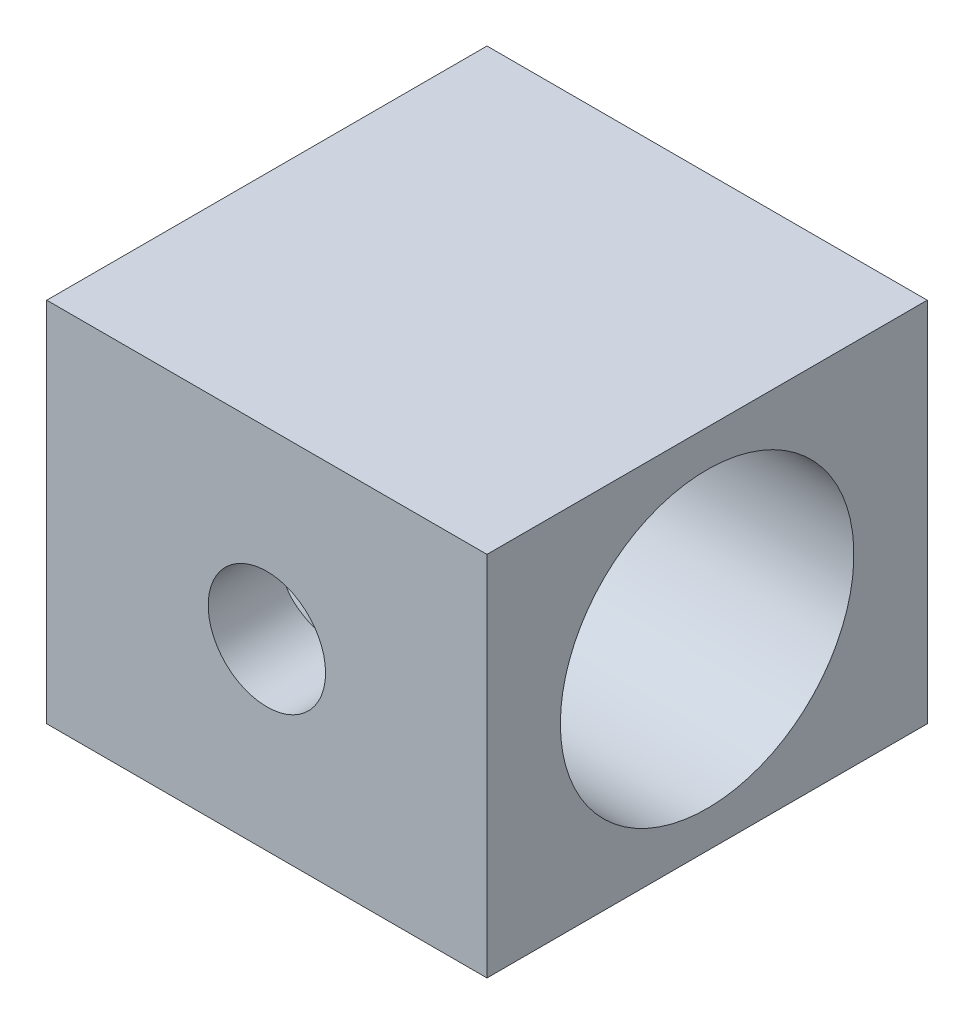
ISO-10303-21;
HEADER;
FILE_DESCRIPTION(('STEP AP214'),'2;1');
FILE_NAME('part.step','',(''),(''),'','','');
FILE_SCHEMA(('AUTOMOTIVE_DESIGN { 1 0 10303 214 1 1 1 1 }'));
ENDSEC;
DATA;
#1=APPLICATION_CONTEXT('core data for automotive mechanical design processes');
#2=APPLICATION_PROTOCOL_DEFINITION('international standard','automotive_design',2000,#1);
#3=PRODUCT_CONTEXT('',#1,'mechanical');
#4=PRODUCT('Part','Part','',(#3));
#5=PRODUCT_RELATED_PRODUCT_CATEGORY('part','',(#4));
#6=PRODUCT_DEFINITION_FORMATION('','',#4);
#7=PRODUCT_DEFINITION_CONTEXT('part definition',#1,'design');
#8=PRODUCT_DEFINITION('design','',#6,#7);
#9=PRODUCT_DEFINITION_SHAPE('','',#8);
#10=(LENGTH_UNIT() NAMED_UNIT(*) SI_UNIT(.MILLI.,.METRE.));
#11=(NAMED_UNIT(*) PLANE_ANGLE_UNIT() SI_UNIT($,.RADIAN.));
#12=(NAMED_UNIT(*) SI_UNIT($,.STERADIAN.) SOLID_ANGLE_UNIT());
#13=UNCERTAINTY_MEASURE_WITH_UNIT(LENGTH_MEASURE(1.E-05),#10,'distance_accuracy_value','');
#14=(GEOMETRIC_REPRESENTATION_CONTEXT(3) GLOBAL_UNCERTAINTY_ASSIGNED_CONTEXT((#13)) GLOBAL_UNIT_ASSIGNED_CONTEXT((#10,
#11,#12)) REPRESENTATION_CONTEXT('',''));
#15=CARTESIAN_POINT('',(0.,0.,0.));
#16=DIRECTION('',(0.,0.,1.));
#17=DIRECTION('',(1.,0.,0.));
#18=AXIS2_PLACEMENT_3D('',#15,#16,#17);
#19=CARTESIAN_POINT('',(15.,-12.5,15.));
#20=DIRECTION('',(-1.,0.,0.));
#21=DIRECTION('',(0.,0.,1.));
#22=AXIS2_PLACEMENT_3D('',#19,#20,#21);
#23=PLANE('',#22);
#24=CARTESIAN_POINT('',(15.,0.,0.));
#25=DIRECTION('',(-1.,0.,0.));
#26=DIRECTION('',(0.,0.,1.));
#27=AXIS2_PLACEMENT_3D('',#24,#25,#26);
#28=CIRCLE('',#27,10.);
#29=CARTESIAN_POINT('',(15.,0.,10.));
#30=VERTEX_POINT('',#29);
#31=EDGE_CURVE('E124',#30,#30,#28,.T.);
#32=ORIENTED_EDGE('',*,*,#31,.T.);
#33=EDGE_LOOP('',(#32));
#34=FACE_BOUND('',#33,.T.);
#35=DIRECTION('',(0.,1.,0.));
#36=VECTOR('',#35,1.);
#37=CARTESIAN_POINT('',(15.,-12.5,-15.));
#38=LINE('',#37,#36);
#39=CARTESIAN_POINT('',(15.,-12.5,-15.));
#40=VERTEX_POINT('',#39);
#41=CARTESIAN_POINT('',(15.,12.5,-15.));
#42=VERTEX_POINT('',#41);
#43=EDGE_CURVE('E120',#40,#42,#38,.T.);
#44=ORIENTED_EDGE('',*,*,#43,.T.);
#45=DIRECTION('',(0.,0.,-1.));
#46=VECTOR('',#45,1.);
#47=CARTESIAN_POINT('',(15.,12.5,15.));
#48=LINE('',#47,#46);
#49=CARTESIAN_POINT('',(15.,12.5,15.));
#50=VERTEX_POINT('',#49);
#51=EDGE_CURVE('E11',#50,#42,#48,.T.);
#52=ORIENTED_EDGE('',*,*,#51,.F.);
#53=DIRECTION('',(0.,1.,0.));
#54=VECTOR('',#53,1.);
#55=CARTESIAN_POINT('',(15.,-12.5,15.));
#56=LINE('',#55,#54);
#57=CARTESIAN_POINT('',(15.,-12.5,15.));
#58=VERTEX_POINT('',#57);
#59=EDGE_CURVE('E103',#58,#50,#56,.T.);
#60=ORIENTED_EDGE('',*,*,#59,.F.);
#61=DIRECTION('',(0.,0.,-1.));
#62=VECTOR('',#61,1.);
#63=CARTESIAN_POINT('',(15.,-12.5,15.));
#64=LINE('',#63,#62);
#65=EDGE_CURVE('E116',#58,#40,#64,.T.);
#66=ORIENTED_EDGE('',*,*,#65,.T.);
#67=EDGE_LOOP('',(#44,#52,#60,#66));
#68=FACE_BOUND('',#67,.T.);
#69=ADVANCED_FACE('F45',(#34,#68),#23,.F.);
#70=CARTESIAN_POINT('',(-15.,12.5,15.));
#71=DIRECTION('',(0.,-1.,0.));
#72=DIRECTION('',(0.,0.,-1.));
#73=AXIS2_PLACEMENT_3D('',#70,#71,#72);
#74=PLANE('',#73);
#75=DIRECTION('',(-1.,0.,0.));
#76=VECTOR('',#75,1.);
#77=CARTESIAN_POINT('',(-15.,12.5,-15.));
#78=LINE('',#77,#76);
#79=CARTESIAN_POINT('',(-15.,12.5,-15.));
#80=VERTEX_POINT('',#79);
#81=EDGE_CURVE('E108',#42,#80,#78,.T.);
#82=ORIENTED_EDGE('',*,*,#81,.T.);
#83=DIRECTION('',(0.,0.,-1.));
#84=VECTOR('',#83,1.);
#85=CARTESIAN_POINT('',(-15.,12.5,15.));
#86=LINE('',#85,#84);
#87=CARTESIAN_POINT('',(-15.,12.5,15.));
#88=VERTEX_POINT('',#87);
#89=EDGE_CURVE('E60',#88,#80,#86,.T.);
#90=ORIENTED_EDGE('',*,*,#89,.F.);
#91=DIRECTION('',(-1.,0.,0.));
#92=VECTOR('',#91,1.);
#93=CARTESIAN_POINT('',(-15.,12.5,15.));
#94=LINE('',#93,#92);
#95=EDGE_CURVE('E98',#50,#88,#94,.T.);
#96=ORIENTED_EDGE('',*,*,#95,.F.);
#97=ORIENTED_EDGE('',*,*,#51,.T.);
#98=EDGE_LOOP('',(#82,#90,#96,#97));
#99=FACE_BOUND('',#98,.T.);
#100=ADVANCED_FACE('F107',(#99),#74,.F.);
#101=CARTESIAN_POINT('',(-15.,-12.5,15.));
#102=DIRECTION('',(1.,0.,0.));
#103=DIRECTION('',(0.,0.,-1.));
#104=AXIS2_PLACEMENT_3D('',#101,#102,#103);
#105=PLANE('',#104);
#106=CARTESIAN_POINT('',(-15.,0.,0.));
#107=DIRECTION('',(-1.,0.,0.));
#108=DIRECTION('',(0.,0.,1.));
#109=AXIS2_PLACEMENT_3D('',#106,#107,#108);
#110=CIRCLE('',#109,10.);
#111=CARTESIAN_POINT('',(-15.,0.,10.));
#112=VERTEX_POINT('',#111);
#113=EDGE_CURVE('E141',#112,#112,#110,.T.);
#114=ORIENTED_EDGE('',*,*,#113,.F.);
#115=EDGE_LOOP('',(#114));
#116=FACE_BOUND('',#115,.T.);
#117=DIRECTION('',(0.,-1.,0.));
#118=VECTOR('',#117,1.);
#119=CARTESIAN_POINT('',(-15.,-12.5,-15.));
#120=LINE('',#119,#118);
#121=CARTESIAN_POINT('',(-15.,-12.5,-15.));
#122=VERTEX_POINT('',#121);
#123=EDGE_CURVE('E85',#80,#122,#120,.T.);
#124=ORIENTED_EDGE('',*,*,#123,.T.);
#125=DIRECTION('',(0.,0.,-1.));
#126=VECTOR('',#125,1.);
#127=CARTESIAN_POINT('',(-15.,-12.5,15.));
#128=LINE('',#127,#126);
#129=CARTESIAN_POINT('',(-15.,-12.5,15.));
#130=VERTEX_POINT('',#129);
#131=EDGE_CURVE('E110',#130,#122,#128,.T.);
#132=ORIENTED_EDGE('',*,*,#131,.F.);
#133=DIRECTION('',(0.,-1.,0.));
#134=VECTOR('',#133,1.);
#135=CARTESIAN_POINT('',(-15.,-12.5,15.));
#136=LINE('',#135,#134);
#137=EDGE_CURVE('E101',#88,#130,#136,.T.);
#138=ORIENTED_EDGE('',*,*,#137,.F.);
#139=ORIENTED_EDGE('',*,*,#89,.T.);
#140=EDGE_LOOP('',(#124,#132,#138,#139));
#141=FACE_BOUND('',#140,.T.);
#142=ADVANCED_FACE('F112',(#116,#141),#105,.F.);
#143=CARTESIAN_POINT('',(-15.,-12.5,15.));
#144=DIRECTION('',(0.,1.,0.));
#145=DIRECTION('',(0.,0.,1.));
#146=AXIS2_PLACEMENT_3D('',#143,#144,#145);
#147=PLANE('',#146);
#148=DIRECTION('',(1.,0.,0.));
#149=VECTOR('',#148,1.);
#150=CARTESIAN_POINT('',(-15.,-12.5,-15.));
#151=LINE('',#150,#149);
#152=EDGE_CURVE('E91',#122,#40,#151,.T.);
#153=ORIENTED_EDGE('',*,*,#152,.T.);
#154=ORIENTED_EDGE('',*,*,#65,.F.);
#155=DIRECTION('',(1.,0.,0.));
#156=VECTOR('',#155,1.);
#157=CARTESIAN_POINT('',(-15.,-12.5,15.));
#158=LINE('',#157,#156);
#159=EDGE_CURVE('E68',#130,#58,#158,.T.);
#160=ORIENTED_EDGE('',*,*,#159,.F.);
#161=ORIENTED_EDGE('',*,*,#131,.T.);
#162=EDGE_LOOP('',(#153,#154,#160,#161));
#163=FACE_BOUND('',#162,.T.);
#164=ADVANCED_FACE('F134',(#163),#147,.F.);
#165=CARTESIAN_POINT('',(0.,0.,15.));
#166=DIRECTION('',(0.,0.,-1.));
#167=DIRECTION('',(-1.,0.,0.));
#168=AXIS2_PLACEMENT_3D('',#165,#166,#167);
#169=PLANE('',#168);
#170=CARTESIAN_POINT('',(0.,0.,15.));
#171=DIRECTION('',(0.,0.,1.));
#172=DIRECTION('',(1.,0.,0.));
#173=AXIS2_PLACEMENT_3D('',#170,#171,#172);
#174=CIRCLE('',#173,4.);
#175=CARTESIAN_POINT('',(4.,0.,15.));
#176=VERTEX_POINT('',#175);
#177=EDGE_CURVE('E148',#176,#176,#174,.T.);
#178=ORIENTED_EDGE('',*,*,#177,.F.);
#179=EDGE_LOOP('',(#178));
#180=FACE_BOUND('',#179,.T.);
#181=ORIENTED_EDGE('',*,*,#59,.T.);
#182=ORIENTED_EDGE('',*,*,#95,.T.);
#183=ORIENTED_EDGE('',*,*,#137,.T.);
#184=ORIENTED_EDGE('',*,*,#159,.T.);
#185=EDGE_LOOP('',(#181,#182,#183,#184));
#186=FACE_BOUND('',#185,.T.);
#187=ADVANCED_FACE('F99',(#180,#186),#169,.F.);
#188=CARTESIAN_POINT('',(0.,0.,-15.));
#189=DIRECTION('',(0.,0.,-1.));
#190=DIRECTION('',(-1.,0.,0.));
#191=AXIS2_PLACEMENT_3D('',#188,#189,#190);
#192=PLANE('',#191);
#193=ORIENTED_EDGE('',*,*,#43,.F.);
#194=ORIENTED_EDGE('',*,*,#152,.F.);
#195=ORIENTED_EDGE('',*,*,#123,.F.);
#196=ORIENTED_EDGE('',*,*,#81,.F.);
#197=EDGE_LOOP('',(#193,#194,#195,#196));
#198=FACE_BOUND('',#197,.T.);
#199=ADVANCED_FACE('F137',(#198),#192,.T.);
#200=CARTESIAN_POINT('',(15.,0.,0.));
#201=DIRECTION('',(-1.,0.,0.));
#202=DIRECTION('',(0.,0.,1.));
#203=AXIS2_PLACEMENT_3D('',#200,#201,#202);
#204=CYLINDRICAL_SURFACE('',#203,10.);
#205=CARTESIAN_POINT('',(4.,0.,10.));
#206=CARTESIAN_POINT('',(3.99999842506708,0.107549581345536,9.99999886871264));
#207=CARTESIAN_POINT('',(3.99565632891985,0.215132147940361,9.99825999367799));
#208=CARTESIAN_POINT('',(3.97832661721607,0.429535200549548,9.99134740691108));
#209=CARTESIAN_POINT('',(3.96533354659737,0.536355162703301,9.98617152790588));
#210=CARTESIAN_POINT('',(3.93079196544944,0.748635856497416,9.97250573560117));
#211=CARTESIAN_POINT('',(3.90922494538018,0.854093134440869,9.96400865312144));
#212=CARTESIAN_POINT('',(3.85775826956324,1.0626676111401,9.94393017211574));
#213=CARTESIAN_POINT('',(3.82785523374471,1.16578384227259,9.932347522545));
#214=CARTESIAN_POINT('',(3.72627719128404,1.46979509681069,9.89349112162205));
#215=CARTESIAN_POINT('',(3.6425781809936,1.66629107461992,9.86204458846134));
#216=CARTESIAN_POINT('',(3.44595378265022,2.04217417878102,9.79113035538708));
#217=CARTESIAN_POINT('',(3.3330385398851,2.22156721456798,9.75166544086262));
#218=CARTESIAN_POINT('',(3.07553124547831,2.56699339938209,9.66661825353092));
#219=CARTESIAN_POINT('',(2.92978728942438,2.73212223266508,9.62084608086599));
#220=CARTESIAN_POINT('',(2.61319939084796,3.03635232313263,9.52921139577231));
#221=CARTESIAN_POINT('',(2.44234324098346,3.17544084661153,9.48334885017047));
#222=CARTESIAN_POINT('',(2.0711440314337,3.42974847409894,9.39445587657958));
#223=CARTESIAN_POINT('',(1.86982707393626,3.54362978572887,9.35164233015934));
#224=CARTESIAN_POINT('',(1.44892715719913,3.73550961465234,9.2766729328807));
#225=CARTESIAN_POINT('',(1.2293529322586,3.81352517485723,9.24451202207146));
#226=CARTESIAN_POINT('',(0.788575344314196,3.92779760260541,9.19652715590089));
#227=CARTESIAN_POINT('',(0.567897531911877,3.96578791979826,9.18002840771385));
#228=CARTESIAN_POINT('',(0.122730000322668,4.00434593508728,9.16328008038143));
#229=CARTESIAN_POINT('',(-0.101757790011111,4.00493203570086,9.16302251073203));
#230=CARTESIAN_POINT('',(-0.531513342223171,3.9699787321474,9.17821000534301));
#231=CARTESIAN_POINT('',(-0.737031428765649,3.93695062778272,9.19256349925666));
#232=CARTESIAN_POINT('',(-1.13931911235034,3.83989376129508,9.23352375055553));
#233=CARTESIAN_POINT('',(-1.33608717630626,3.77585958980135,9.26013264599921));
#234=CARTESIAN_POINT('',(-1.72003567229194,3.6173894649114,9.32318970221162));
#235=CARTESIAN_POINT('',(-1.90693847808248,3.52235972457939,9.35982758573424));
#236=CARTESIAN_POINT('',(-2.26283163275004,3.30501292151569,9.43876232767927));
#237=CARTESIAN_POINT('',(-2.43181521881307,3.1826856102159,9.48106130910412));
#238=CARTESIAN_POINT('',(-2.76081945759596,2.90310119889356,9.57053473488081));
#239=CARTESIAN_POINT('',(-2.91913745888988,2.74387492593717,9.61783329953252));
#240=CARTESIAN_POINT('',(-3.20736895600623,2.40062885486449,9.70919649915615));
#241=CARTESIAN_POINT('',(-3.33727679482117,2.21660413066997,9.75326048890393));
#242=CARTESIAN_POINT('',(-3.56723489483107,1.82415530521055,9.83429362529358));
#243=CARTESIAN_POINT('',(-3.66664456239394,1.61532098269266,9.87110540190899));
#244=CARTESIAN_POINT('',(-3.82833572215627,1.18204753096606,9.93229656657448));
#245=CARTESIAN_POINT('',(-3.89063607511487,0.9576163936994,9.95668226924746));
#246=CARTESIAN_POINT('',(-3.97289659083936,0.513791775215592,9.98912279013839));
#247=CARTESIAN_POINT('',(-3.99514490850706,0.294886587971141,9.99805891667034));
#248=CARTESIAN_POINT('',(-4.00342620105728,-0.143690619615706,10.0013695702126));
#249=CARTESIAN_POINT('',(-3.98946856309519,-0.363362426448182,9.99574787164577));
#250=CARTESIAN_POINT('',(-3.92741649489586,-0.786865478243654,9.97115134127512));
#251=CARTESIAN_POINT('',(-3.88088403929747,-0.990964983549761,9.95278782691064));
#252=CARTESIAN_POINT('',(-3.75712858338095,-1.38827085612275,9.90518882810983));
#253=CARTESIAN_POINT('',(-3.67990164066479,-1.58147582045412,9.87595194712999));
#254=CARTESIAN_POINT('',(-3.49443012063789,-1.95815757162884,9.80833189541687));
#255=CARTESIAN_POINT('',(-3.38530905590533,-2.14115604549353,9.76969631959847));
#256=CARTESIAN_POINT('',(-3.14011935219709,-2.4868871825104,9.68746729490809));
#257=CARTESIAN_POINT('',(-3.00403991418609,-2.64961168158684,9.64387186219643));
#258=CARTESIAN_POINT('',(-2.69825997406736,-2.96144608598878,9.55290235277181));
#259=CARTESIAN_POINT('',(-2.52693291685915,-3.10894786734725,9.50546882853787));
#260=CARTESIAN_POINT('',(-2.16111983410972,-3.37350239509234,9.4148334583058));
#261=CARTESIAN_POINT('',(-1.96662999980056,-3.4905501236659,9.37163231039242));
#262=CARTESIAN_POINT('',(-1.55707661032668,-3.69161500286277,9.2942859982933));
#263=CARTESIAN_POINT('',(-1.34183199975651,-3.77530118531766,9.2602326182174));
#264=CARTESIAN_POINT('',(-0.898532698387222,-3.90459244315908,9.20647346903737));
#265=CARTESIAN_POINT('',(-0.670487595158195,-3.95022562452798,9.1867571119746));
#266=CARTESIAN_POINT('',(-0.225744190155994,-3.99943122157416,9.16543518780389));
#267=CARTESIAN_POINT('',(-0.00941029810496796,-4.0057941177721,9.16262842667612));
#268=CARTESIAN_POINT('',(0.421089692721141,-3.98360636538274,9.17229671415009));
#269=CARTESIAN_POINT('',(0.635256063282472,-3.9550601501471,9.18476982225497));
#270=CARTESIAN_POINT('',(1.0466644608903,-3.86614256488129,9.2225330048627));
#271=CARTESIAN_POINT('',(1.24424084622109,-3.80707437387706,9.2472967218297));
#272=CARTESIAN_POINT('',(1.6267569617897,-3.66001151041638,9.30647993934966));
#273=CARTESIAN_POINT('',(1.81169318511131,-3.5720088493455,9.34090210615105));
#274=CARTESIAN_POINT('',(2.17522041070948,-3.36374310804133,9.41797252826471));
#275=CARTESIAN_POINT('',(2.35284183068834,-3.24192140926543,9.46097893410836));
#276=CARTESIAN_POINT('',(2.68598214262481,-2.97179350239177,9.54927479921251));
#277=CARTESIAN_POINT('',(2.84149434728997,-2.82347931168581,9.59456494363941));
#278=CARTESIAN_POINT('',(3.13642359253059,-2.49297412446699,9.68587647140965));
#279=CARTESIAN_POINT('',(3.2741433839823,-2.30921017071955,9.73175488236393));
#280=CARTESIAN_POINT('',(3.45604810893752,-2.01716584575533,9.7949502762577));
#281=CARTESIAN_POINT('',(3.51260706385296,-1.91699501972424,9.81509269692655));
#282=CARTESIAN_POINT('',(3.61703799540528,-1.7118011098248,9.85294835133019));
#283=CARTESIAN_POINT('',(3.66491394980801,-1.60678027559742,9.87066269647665));
#284=CARTESIAN_POINT('',(3.75074798468496,-1.39454646904328,9.9028559935491));
#285=CARTESIAN_POINT('',(3.78887015474716,-1.28740777135872,9.91738778532477));
#286=CARTESIAN_POINT('',(3.85592134772125,-1.06995577523383,9.94319722915714));
#287=CARTESIAN_POINT('',(3.8848546573499,-0.95964398335262,9.95447639837582));
#288=CARTESIAN_POINT('',(3.93317483614903,-0.736945215856838,9.97343330649399));
#289=CARTESIAN_POINT('',(3.95258591164496,-0.624564263591282,9.98112017494336));
#290=CARTESIAN_POINT('',(3.98173857066623,-0.398419132407605,9.99270031578293));
#291=CARTESIAN_POINT('',(3.99148702683432,-0.284655994966355,9.99659628445551));
#292=CARTESIAN_POINT('',(3.99878589557345,-0.113830463425493,9.99951445883957));
#293=CARTESIAN_POINT('',(4.00000083352205,-0.0569198512645306,10.0000005987258));
#294=CARTESIAN_POINT('',(4.,0.,10.));
#295=B_SPLINE_CURVE_WITH_KNOTS('',3,(#205,#206,#207,#208,#209,#210,#211,#212,#213,#214,#215,
#216,#217,#218,#219,#220,#221,#222,#223,#224,#225,#226,#227,#228,#229,#230,#231,#232,#233,#234,
#235,#236,#237,#238,#239,#240,#241,#242,#243,#244,#245,#246,#247,#248,#249,#250,#251,#252,#253,
#254,#255,#256,#257,#258,#259,#260,#261,#262,#263,#264,#265,#266,#267,#268,#269,#270,#271,#272,
#273,#274,#275,#276,#277,#278,#279,#280,#281,#282,#283,#284,#285,#286,#287,#288,#289,#290,#291,
#292,#293,#294),.UNSPECIFIED.,.T.,.F.,(4,2,2,2,2,2,2,2,2,2,2,2,2,2,2,2,2,2,2,2,2,2,2,2,2,2,2,2,
2,2,2,2,2,2,2,2,2,2,2,2,2,2,2,2,4),(0.,0.322603993422155,0.645411604786482,0.968919914471235,
1.29255959093094,1.93701523385824,2.58124739027476,3.25313995292302,3.9253602176033,
4.62749749529941,5.32930078128044,5.99927442509165,6.66891844572483,7.29195888698823,
7.9151080641227,8.55097484497807,9.18708075776542,9.87235930273289,10.5577741757964,
11.2567305822579,11.9553314412776,12.6125760095619,13.2696501904034,13.8972014302891,
14.5248332988777,15.171662586967,15.8187515089811,16.50856181149,17.1984856998767,
17.8950932218183,18.5911857719204,19.2371857868567,19.8831037702627,20.5034786899771,
21.124025035105,21.7801016801356,22.4363763459696,23.1352007896785,23.4851924266232,
23.8350233218042,24.1785111324565,24.52183846562,24.8642884495951,25.2064946871486,
25.3772305569977),.UNSPECIFIED.);
#296=CARTESIAN_POINT('',(4.,0.,10.));
#297=VERTEX_POINT('',#296);
#298=EDGE_CURVE('E48',#297,#297,#295,.T.);
#299=ORIENTED_EDGE('',*,*,#298,.T.);
#300=EDGE_LOOP('',(#299));
#301=FACE_BOUND('',#300,.T.);
#302=ORIENTED_EDGE('',*,*,#31,.F.);
#303=EDGE_LOOP('',(#302));
#304=FACE_BOUND('',#303,.T.);
#305=ORIENTED_EDGE('',*,*,#113,.T.);
#306=EDGE_LOOP('',(#305));
#307=FACE_BOUND('',#306,.T.);
#308=ADVANCED_FACE('F157',(#301,#304,#307),#204,.F.);
#309=CARTESIAN_POINT('',(0.,0.,-11.3137084989848));
#310=DIRECTION('',(0.,0.,1.));
#311=DIRECTION('',(1.,0.,0.));
#312=AXIS2_PLACEMENT_3D('',#309,#310,#311);
#313=CYLINDRICAL_SURFACE('',#312,4.);
#314=ORIENTED_EDGE('',*,*,#177,.T.);
#315=EDGE_LOOP('',(#314));
#316=FACE_BOUND('',#315,.T.);
#317=ORIENTED_EDGE('',*,*,#298,.F.);
#318=EDGE_LOOP('',(#317));
#319=FACE_BOUND('',#318,.T.);
#320=ADVANCED_FACE('F160',(#316,#319),#313,.F.);
#321=CLOSED_SHELL('',(#69,#100,#142,#164,#187,#199,#308,#320));
#322=MANIFOLD_SOLID_BREP('B2',#321);
#323=ADVANCED_BREP_SHAPE_REPRESENTATION('',(#18,#322),#14);
#324=SHAPE_DEFINITION_REPRESENTATION(#9,#323);
ENDSEC;
END-ISO-10303-21;
